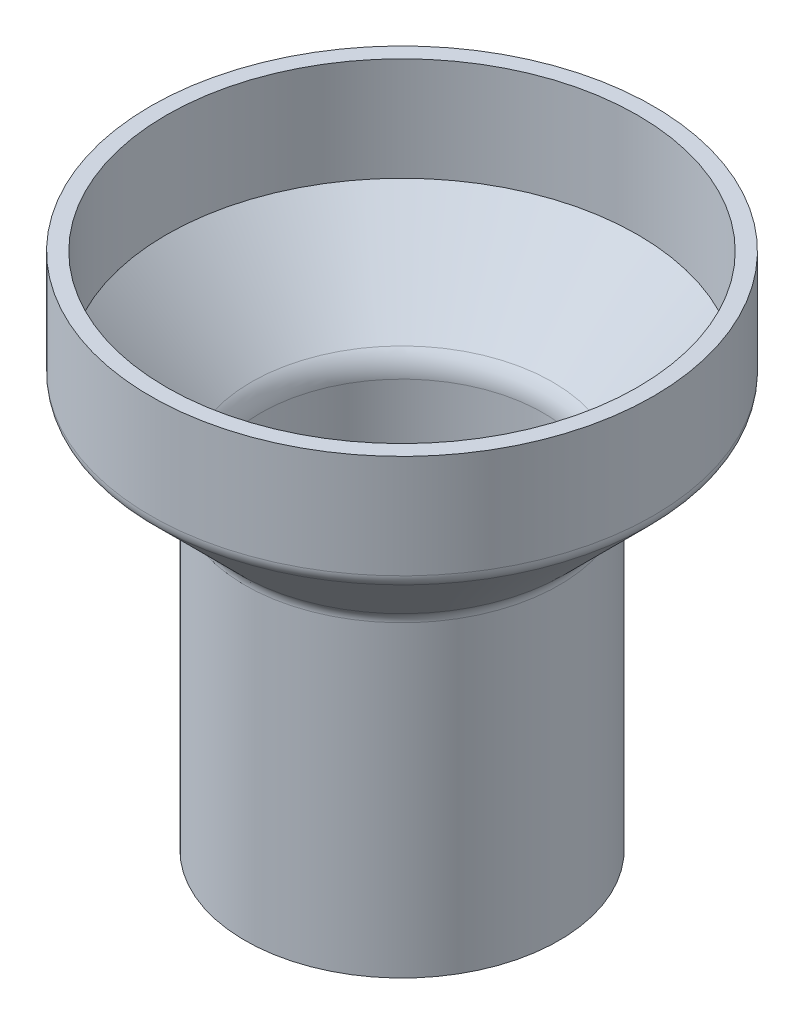
ISO-10303-21;
HEADER;
FILE_DESCRIPTION(('STEP AP214'),'2;1');
FILE_NAME('part.step','',(''),(''),'','','');
FILE_SCHEMA(('AUTOMOTIVE_DESIGN { 1 0 10303 214 1 1 1 1 }'));
ENDSEC;
DATA;
#1=APPLICATION_CONTEXT('core data for automotive mechanical design processes');
#2=APPLICATION_PROTOCOL_DEFINITION('international standard','automotive_design',2000,#1);
#3=PRODUCT_CONTEXT('',#1,'mechanical');
#4=PRODUCT('Part','Part','',(#3));
#5=PRODUCT_RELATED_PRODUCT_CATEGORY('part','',(#4));
#6=PRODUCT_DEFINITION_FORMATION('','',#4);
#7=PRODUCT_DEFINITION_CONTEXT('part definition',#1,'design');
#8=PRODUCT_DEFINITION('design','',#6,#7);
#9=PRODUCT_DEFINITION_SHAPE('','',#8);
#10=(LENGTH_UNIT() NAMED_UNIT(*) SI_UNIT(.MILLI.,.METRE.));
#11=(NAMED_UNIT(*) PLANE_ANGLE_UNIT() SI_UNIT($,.RADIAN.));
#12=(NAMED_UNIT(*) SI_UNIT($,.STERADIAN.) SOLID_ANGLE_UNIT());
#13=UNCERTAINTY_MEASURE_WITH_UNIT(LENGTH_MEASURE(1.E-05),#10,'distance_accuracy_value','');
#14=(GEOMETRIC_REPRESENTATION_CONTEXT(3) GLOBAL_UNCERTAINTY_ASSIGNED_CONTEXT((#13)) GLOBAL_UNIT_ASSIGNED_CONTEXT((#10,
#11,#12)) REPRESENTATION_CONTEXT('',''));
#15=CARTESIAN_POINT('',(0.,0.,0.));
#16=DIRECTION('',(0.,0.,1.));
#17=DIRECTION('',(1.,0.,0.));
#18=AXIS2_PLACEMENT_3D('',#15,#16,#17);
#19=CARTESIAN_POINT('',(0.,0.,0.));
#20=DIRECTION('',(0.,-1.,0.));
#21=DIRECTION('',(1.,0.,0.));
#22=AXIS2_PLACEMENT_3D('',#19,#20,#21);
#23=PLANE('',#22);
#24=CARTESIAN_POINT('',(0.,0.,0.));
#25=DIRECTION('',(0.,1.,0.));
#26=DIRECTION('',(-1.,0.,0.));
#27=AXIS2_PLACEMENT_3D('',#24,#25,#26);
#28=CIRCLE('',#27,10.);
#29=CARTESIAN_POINT('',(-10.,0.,0.));
#30=VERTEX_POINT('',#29);
#31=EDGE_CURVE('E54',#30,#30,#28,.T.);
#32=ORIENTED_EDGE('',*,*,#31,.F.);
#33=EDGE_LOOP('',(#32));
#34=FACE_BOUND('',#33,.T.);
#35=CARTESIAN_POINT('',(0.,0.,0.));
#36=DIRECTION('',(0.,-1.,0.));
#37=DIRECTION('',(1.,0.,0.));
#38=AXIS2_PLACEMENT_3D('',#35,#36,#37);
#39=CIRCLE('',#38,9.);
#40=CARTESIAN_POINT('',(9.,0.,0.));
#41=VERTEX_POINT('',#40);
#42=EDGE_CURVE('E64',#41,#41,#39,.F.);
#43=ORIENTED_EDGE('',*,*,#42,.T.);
#44=EDGE_LOOP('',(#43));
#45=FACE_BOUND('',#44,.T.);
#46=ADVANCED_FACE('F34',(#34,#45),#23,.T.);
#47=CARTESIAN_POINT('',(0.,33.,0.));
#48=DIRECTION('',(0.,1.,0.));
#49=DIRECTION('',(-1.,0.,0.));
#50=AXIS2_PLACEMENT_3D('',#47,#48,#49);
#51=CYLINDRICAL_SURFACE('',#50,10.);
#52=CARTESIAN_POINT('',(0.,19.5857864376269,0.));
#53=DIRECTION('',(0.,1.,0.));
#54=DIRECTION('',(-1.,0.,0.));
#55=AXIS2_PLACEMENT_3D('',#52,#53,#54);
#56=CIRCLE('',#55,10.);
#57=CARTESIAN_POINT('',(-10.,19.5857864376269,0.));
#58=VERTEX_POINT('',#57);
#59=EDGE_CURVE('E10',#58,#58,#56,.F.);
#60=ORIENTED_EDGE('',*,*,#59,.T.);
#61=EDGE_LOOP('',(#60));
#62=FACE_BOUND('',#61,.T.);
#63=ORIENTED_EDGE('',*,*,#31,.T.);
#64=EDGE_LOOP('',(#63));
#65=FACE_BOUND('',#64,.T.);
#66=ADVANCED_FACE('F87',(#62,#65),#51,.T.);
#67=CARTESIAN_POINT('',(0.,26.,0.));
#68=DIRECTION('',(0.,1.,0.));
#69=DIRECTION('',(-1.,0.,0.));
#70=AXIS2_PLACEMENT_3D('',#67,#68,#69);
#71=CONICAL_SURFACE('',#70,16.,0.78539816339745);
#72=CARTESIAN_POINT('',(0.,25.7071067811865,0.));
#73=DIRECTION('',(0.,-1.,0.));
#74=DIRECTION('',(1.,0.,0.));
#75=AXIS2_PLACEMENT_3D('',#72,#73,#74);
#76=CIRCLE('',#75,15.7071067811865);
#77=CARTESIAN_POINT('',(15.7071067811866,25.7071067811865,0.));
#78=VERTEX_POINT('',#77);
#79=EDGE_CURVE('E41',#78,#78,#76,.T.);
#80=ORIENTED_EDGE('',*,*,#79,.T.);
#81=EDGE_LOOP('',(#80));
#82=FACE_BOUND('',#81,.T.);
#83=CARTESIAN_POINT('',(0.,20.2928932188135,0.));
#84=DIRECTION('',(0.,1.,0.));
#85=DIRECTION('',(-1.,0.,0.));
#86=AXIS2_PLACEMENT_3D('',#83,#84,#85);
#87=CIRCLE('',#86,10.2928932188135);
#88=CARTESIAN_POINT('',(-10.2928932188135,20.2928932188135,0.));
#89=VERTEX_POINT('',#88);
#90=EDGE_CURVE('E45',#89,#89,#87,.T.);
#91=ORIENTED_EDGE('',*,*,#90,.T.);
#92=EDGE_LOOP('',(#91));
#93=FACE_BOUND('',#92,.T.);
#94=ADVANCED_FACE('F93',(#82,#93),#71,.T.);
#95=CARTESIAN_POINT('',(0.,33.,0.));
#96=DIRECTION('',(0.,1.,0.));
#97=DIRECTION('',(-1.,0.,0.));
#98=AXIS2_PLACEMENT_3D('',#95,#96,#97);
#99=CYLINDRICAL_SURFACE('',#98,16.);
#100=CARTESIAN_POINT('',(0.,26.4142135623731,0.));
#101=DIRECTION('',(0.,-1.,0.));
#102=DIRECTION('',(1.,0.,0.));
#103=AXIS2_PLACEMENT_3D('',#100,#101,#102);
#104=CIRCLE('',#103,16.);
#105=CARTESIAN_POINT('',(16.,26.4142135623731,0.));
#106=VERTEX_POINT('',#105);
#107=EDGE_CURVE('E49',#106,#106,#104,.F.);
#108=ORIENTED_EDGE('',*,*,#107,.T.);
#109=EDGE_LOOP('',(#108));
#110=FACE_BOUND('',#109,.T.);
#111=CARTESIAN_POINT('',(0.,33.,0.));
#112=DIRECTION('',(0.,1.,0.));
#113=DIRECTION('',(-1.,0.,0.));
#114=AXIS2_PLACEMENT_3D('',#111,#112,#113);
#115=CIRCLE('',#114,16.);
#116=CARTESIAN_POINT('',(-16.,33.,0.));
#117=VERTEX_POINT('',#116);
#118=EDGE_CURVE('E57',#117,#117,#115,.T.);
#119=ORIENTED_EDGE('',*,*,#118,.F.);
#120=EDGE_LOOP('',(#119));
#121=FACE_BOUND('',#120,.T.);
#122=ADVANCED_FACE('F106',(#110,#121),#99,.T.);
#123=CARTESIAN_POINT('',(-16.,33.,0.));
#124=DIRECTION('',(0.,1.,0.));
#125=DIRECTION('',(-1.,0.,0.));
#126=AXIS2_PLACEMENT_3D('',#123,#124,#125);
#127=PLANE('',#126);
#128=CARTESIAN_POINT('',(0.,33.,0.));
#129=DIRECTION('',(0.,1.,0.));
#130=DIRECTION('',(-1.,0.,0.));
#131=AXIS2_PLACEMENT_3D('',#128,#129,#130);
#132=CIRCLE('',#131,15.);
#133=CARTESIAN_POINT('',(-15.,33.,0.));
#134=VERTEX_POINT('',#133);
#135=EDGE_CURVE('E61',#134,#134,#132,.T.);
#136=ORIENTED_EDGE('',*,*,#135,.F.);
#137=EDGE_LOOP('',(#136));
#138=FACE_BOUND('',#137,.T.);
#139=ORIENTED_EDGE('',*,*,#118,.T.);
#140=EDGE_LOOP('',(#139));
#141=FACE_BOUND('',#140,.T.);
#142=ADVANCED_FACE('F99',(#138,#141),#127,.T.);
#143=CARTESIAN_POINT('',(0.,26.4142135623731,0.));
#144=DIRECTION('',(0.,-1.,0.));
#145=DIRECTION('',(1.,0.,0.));
#146=AXIS2_PLACEMENT_3D('',#143,#144,#145);
#147=TOROIDAL_SURFACE('',#146,15.,1.);
#148=ORIENTED_EDGE('',*,*,#79,.F.);
#149=EDGE_LOOP('',(#148));
#150=FACE_BOUND('',#149,.T.);
#151=ORIENTED_EDGE('',*,*,#107,.F.);
#152=EDGE_LOOP('',(#151));
#153=FACE_BOUND('',#152,.T.);
#154=ADVANCED_FACE('F97',(#150,#153),#147,.T.);
#155=CARTESIAN_POINT('',(0.,19.5857864376269,0.));
#156=DIRECTION('',(0.,1.,0.));
#157=DIRECTION('',(-1.,0.,0.));
#158=AXIS2_PLACEMENT_3D('',#155,#156,#157);
#159=TOROIDAL_SURFACE('',#158,11.,1.);
#160=ORIENTED_EDGE('',*,*,#59,.F.);
#161=EDGE_LOOP('',(#160));
#162=FACE_BOUND('',#161,.T.);
#163=ORIENTED_EDGE('',*,*,#90,.F.);
#164=EDGE_LOOP('',(#163));
#165=FACE_BOUND('',#164,.T.);
#166=ADVANCED_FACE('F36',(#162,#165),#159,.F.);
#167=CARTESIAN_POINT('',(0.,33.,0.));
#168=DIRECTION('',(0.,1.,0.));
#169=DIRECTION('',(-1.,0.,0.));
#170=AXIS2_PLACEMENT_3D('',#167,#168,#169);
#171=CYLINDRICAL_SURFACE('',#170,9.);
#172=CARTESIAN_POINT('',(0.,19.5857864376269,0.));
#173=DIRECTION('',(0.,1.,0.));
#174=DIRECTION('',(-1.,0.,0.));
#175=AXIS2_PLACEMENT_3D('',#172,#173,#174);
#176=CIRCLE('',#175,9.);
#177=CARTESIAN_POINT('',(-9.,19.5857864376269,0.));
#178=VERTEX_POINT('',#177);
#179=EDGE_CURVE('E60',#178,#178,#176,.F.);
#180=ORIENTED_EDGE('',*,*,#179,.F.);
#181=EDGE_LOOP('',(#180));
#182=FACE_BOUND('',#181,.T.);
#183=ORIENTED_EDGE('',*,*,#42,.F.);
#184=EDGE_LOOP('',(#183));
#185=FACE_BOUND('',#184,.T.);
#186=ADVANCED_FACE('F79',(#182,#185),#171,.F.);
#187=CARTESIAN_POINT('',(0.,26.7071067811865,0.));
#188=DIRECTION('',(0.,1.,0.));
#189=DIRECTION('',(-1.,0.,0.));
#190=AXIS2_PLACEMENT_3D('',#187,#188,#189);
#191=CONICAL_SURFACE('',#190,15.2928932188135,0.78539816339745);
#192=CARTESIAN_POINT('',(0.,26.4142135623731,0.));
#193=DIRECTION('',(0.,1.,0.));
#194=DIRECTION('',(-1.,0.,0.));
#195=AXIS2_PLACEMENT_3D('',#192,#193,#194);
#196=CIRCLE('',#195,15.);
#197=CARTESIAN_POINT('',(-15.,26.4142135623731,0.));
#198=VERTEX_POINT('',#197);
#199=EDGE_CURVE('E67',#198,#198,#196,.T.);
#200=ORIENTED_EDGE('',*,*,#199,.T.);
#201=EDGE_LOOP('',(#200));
#202=FACE_BOUND('',#201,.T.);
#203=CARTESIAN_POINT('',(0.,21.,0.));
#204=DIRECTION('',(0.,1.,0.));
#205=DIRECTION('',(-1.,0.,0.));
#206=AXIS2_PLACEMENT_3D('',#203,#204,#205);
#207=CIRCLE('',#206,9.58578643762691);
#208=CARTESIAN_POINT('',(-9.58578643762691,21.,0.));
#209=VERTEX_POINT('',#208);
#210=EDGE_CURVE('E70',#209,#209,#207,.T.);
#211=ORIENTED_EDGE('',*,*,#210,.F.);
#212=EDGE_LOOP('',(#211));
#213=FACE_BOUND('',#212,.T.);
#214=ADVANCED_FACE('F82',(#202,#213),#191,.F.);
#215=CARTESIAN_POINT('',(0.,33.,0.));
#216=DIRECTION('',(0.,1.,0.));
#217=DIRECTION('',(-1.,0.,0.));
#218=AXIS2_PLACEMENT_3D('',#215,#216,#217);
#219=CYLINDRICAL_SURFACE('',#218,15.);
#220=ORIENTED_EDGE('',*,*,#199,.F.);
#221=EDGE_LOOP('',(#220));
#222=FACE_BOUND('',#221,.T.);
#223=ORIENTED_EDGE('',*,*,#135,.T.);
#224=EDGE_LOOP('',(#223));
#225=FACE_BOUND('',#224,.T.);
#226=ADVANCED_FACE('F123',(#222,#225),#219,.F.);
#227=CARTESIAN_POINT('',(0.,19.5857864376269,0.));
#228=DIRECTION('',(0.,1.,0.));
#229=DIRECTION('',(-1.,0.,0.));
#230=AXIS2_PLACEMENT_3D('',#227,#228,#229);
#231=TOROIDAL_SURFACE('',#230,11.,2.);
#232=ORIENTED_EDGE('',*,*,#179,.T.);
#233=EDGE_LOOP('',(#232));
#234=FACE_BOUND('',#233,.T.);
#235=ORIENTED_EDGE('',*,*,#210,.T.);
#236=EDGE_LOOP('',(#235));
#237=FACE_BOUND('',#236,.T.);
#238=ADVANCED_FACE('F76',(#234,#237),#231,.T.);
#239=CLOSED_SHELL('',(#46,#66,#94,#122,#142,#154,#166,#186,#214,#226,#238));
#240=MANIFOLD_SOLID_BREP('B2',#239);
#241=ADVANCED_BREP_SHAPE_REPRESENTATION('',(#18,#240),#14);
#242=SHAPE_DEFINITION_REPRESENTATION(#9,#241);
ENDSEC;
END-ISO-10303-21;
